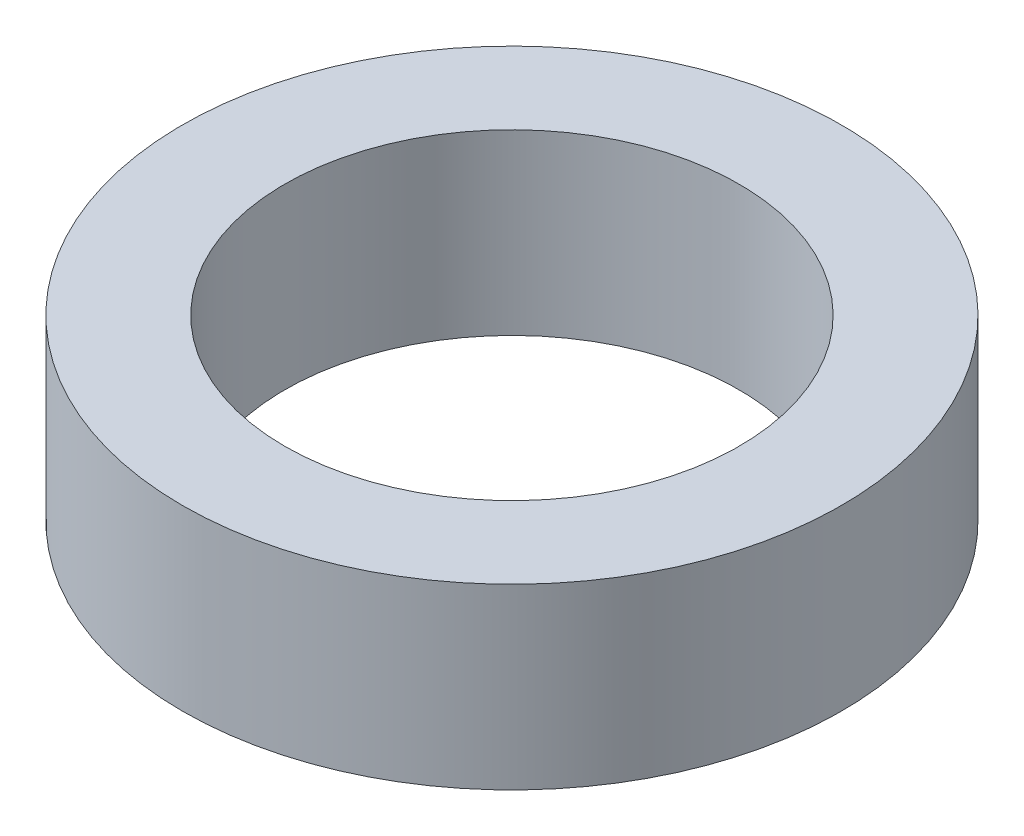
ISO-10303-21;
HEADER;
FILE_DESCRIPTION(('STEP AP214'),'2;1');
FILE_NAME('part.step','',(''),(''),'','','');
FILE_SCHEMA(('AUTOMOTIVE_DESIGN { 1 0 10303 214 1 1 1 1 }'));
ENDSEC;
DATA;
#1=APPLICATION_CONTEXT('core data for automotive mechanical design processes');
#2=APPLICATION_PROTOCOL_DEFINITION('international standard','automotive_design',2000,#1);
#3=PRODUCT_CONTEXT('',#1,'mechanical');
#4=PRODUCT('Part','Part','',(#3));
#5=PRODUCT_RELATED_PRODUCT_CATEGORY('part','',(#4));
#6=PRODUCT_DEFINITION_FORMATION('','',#4);
#7=PRODUCT_DEFINITION_CONTEXT('part definition',#1,'design');
#8=PRODUCT_DEFINITION('design','',#6,#7);
#9=PRODUCT_DEFINITION_SHAPE('','',#8);
#10=(LENGTH_UNIT() NAMED_UNIT(*) SI_UNIT(.MILLI.,.METRE.));
#11=(NAMED_UNIT(*) PLANE_ANGLE_UNIT() SI_UNIT($,.RADIAN.));
#12=(NAMED_UNIT(*) SI_UNIT($,.STERADIAN.) SOLID_ANGLE_UNIT());
#13=UNCERTAINTY_MEASURE_WITH_UNIT(LENGTH_MEASURE(1.E-05),#10,'distance_accuracy_value','');
#14=(GEOMETRIC_REPRESENTATION_CONTEXT(3) GLOBAL_UNCERTAINTY_ASSIGNED_CONTEXT((#13)) GLOBAL_UNIT_ASSIGNED_CONTEXT((#10,
#11,#12)) REPRESENTATION_CONTEXT('',''));
#15=CARTESIAN_POINT('',(0.,0.,0.));
#16=DIRECTION('',(0.,0.,1.));
#17=DIRECTION('',(1.,0.,0.));
#18=AXIS2_PLACEMENT_3D('',#15,#16,#17);
#19=CARTESIAN_POINT('',(0.,4.,0.));
#20=DIRECTION('',(0.,1.,0.));
#21=DIRECTION('',(0.,0.,1.));
#22=AXIS2_PLACEMENT_3D('',#19,#20,#21);
#23=PLANE('',#22);
#24=CARTESIAN_POINT('',(0.,4.,0.));
#25=DIRECTION('',(0.,1.,0.));
#26=DIRECTION('',(0.,0.,1.));
#27=AXIS2_PLACEMENT_3D('',#24,#25,#26);
#28=CIRCLE('',#27,7.4);
#29=CARTESIAN_POINT('',(0.,4.,7.4));
#30=VERTEX_POINT('',#29);
#31=EDGE_CURVE('E10',#30,#30,#28,.T.);
#32=ORIENTED_EDGE('',*,*,#31,.T.);
#33=EDGE_LOOP('',(#32));
#34=FACE_BOUND('',#33,.T.);
#35=CARTESIAN_POINT('',(0.,4.,0.));
#36=DIRECTION('',(0.,1.,0.));
#37=DIRECTION('',(0.,0.,1.));
#38=AXIS2_PLACEMENT_3D('',#35,#36,#37);
#39=CIRCLE('',#38,5.1);
#40=CARTESIAN_POINT('',(0.,4.,5.1));
#41=VERTEX_POINT('',#40);
#42=EDGE_CURVE('E42',#41,#41,#39,.T.);
#43=ORIENTED_EDGE('',*,*,#42,.F.);
#44=EDGE_LOOP('',(#43));
#45=FACE_BOUND('',#44,.T.);
#46=ADVANCED_FACE('F31',(#34,#45),#23,.T.);
#47=CARTESIAN_POINT('',(0.,0.,0.));
#48=DIRECTION('',(0.,1.,0.));
#49=DIRECTION('',(0.,0.,1.));
#50=AXIS2_PLACEMENT_3D('',#47,#48,#49);
#51=PLANE('',#50);
#52=CARTESIAN_POINT('',(0.,0.,0.));
#53=DIRECTION('',(0.,1.,0.));
#54=DIRECTION('',(0.,0.,1.));
#55=AXIS2_PLACEMENT_3D('',#52,#53,#54);
#56=CIRCLE('',#55,7.4);
#57=CARTESIAN_POINT('',(0.,0.,7.4));
#58=VERTEX_POINT('',#57);
#59=EDGE_CURVE('E35',#58,#58,#56,.T.);
#60=ORIENTED_EDGE('',*,*,#59,.F.);
#61=EDGE_LOOP('',(#60));
#62=FACE_BOUND('',#61,.T.);
#63=CARTESIAN_POINT('',(0.,0.,0.));
#64=DIRECTION('',(0.,1.,0.));
#65=DIRECTION('',(0.,0.,1.));
#66=AXIS2_PLACEMENT_3D('',#63,#64,#65);
#67=CIRCLE('',#66,5.1);
#68=CARTESIAN_POINT('',(0.,0.,5.1));
#69=VERTEX_POINT('',#68);
#70=EDGE_CURVE('E44',#69,#69,#67,.T.);
#71=ORIENTED_EDGE('',*,*,#70,.T.);
#72=EDGE_LOOP('',(#71));
#73=FACE_BOUND('',#72,.T.);
#74=ADVANCED_FACE('F54',(#62,#73),#51,.F.);
#75=CARTESIAN_POINT('',(0.,4.,0.));
#76=DIRECTION('',(0.,-1.,0.));
#77=DIRECTION('',(0.,0.,-1.));
#78=AXIS2_PLACEMENT_3D('',#75,#76,#77);
#79=CYLINDRICAL_SURFACE('',#78,7.4);
#80=ORIENTED_EDGE('',*,*,#31,.F.);
#81=EDGE_LOOP('',(#80));
#82=FACE_BOUND('',#81,.T.);
#83=ORIENTED_EDGE('',*,*,#59,.T.);
#84=EDGE_LOOP('',(#83));
#85=FACE_BOUND('',#84,.T.);
#86=ADVANCED_FACE('F33',(#82,#85),#79,.T.);
#87=CARTESIAN_POINT('',(0.,4.,0.));
#88=DIRECTION('',(0.,-1.,0.));
#89=DIRECTION('',(0.,0.,-1.));
#90=AXIS2_PLACEMENT_3D('',#87,#88,#89);
#91=CYLINDRICAL_SURFACE('',#90,5.1);
#92=ORIENTED_EDGE('',*,*,#42,.T.);
#93=EDGE_LOOP('',(#92));
#94=FACE_BOUND('',#93,.T.);
#95=ORIENTED_EDGE('',*,*,#70,.F.);
#96=EDGE_LOOP('',(#95));
#97=FACE_BOUND('',#96,.T.);
#98=ADVANCED_FACE('F50',(#94,#97),#91,.F.);
#99=CLOSED_SHELL('',(#46,#74,#86,#98));
#100=MANIFOLD_SOLID_BREP('B2',#99);
#101=ADVANCED_BREP_SHAPE_REPRESENTATION('',(#18,#100),#14);
#102=SHAPE_DEFINITION_REPRESENTATION(#9,#101);
ENDSEC;
END-ISO-10303-21;
